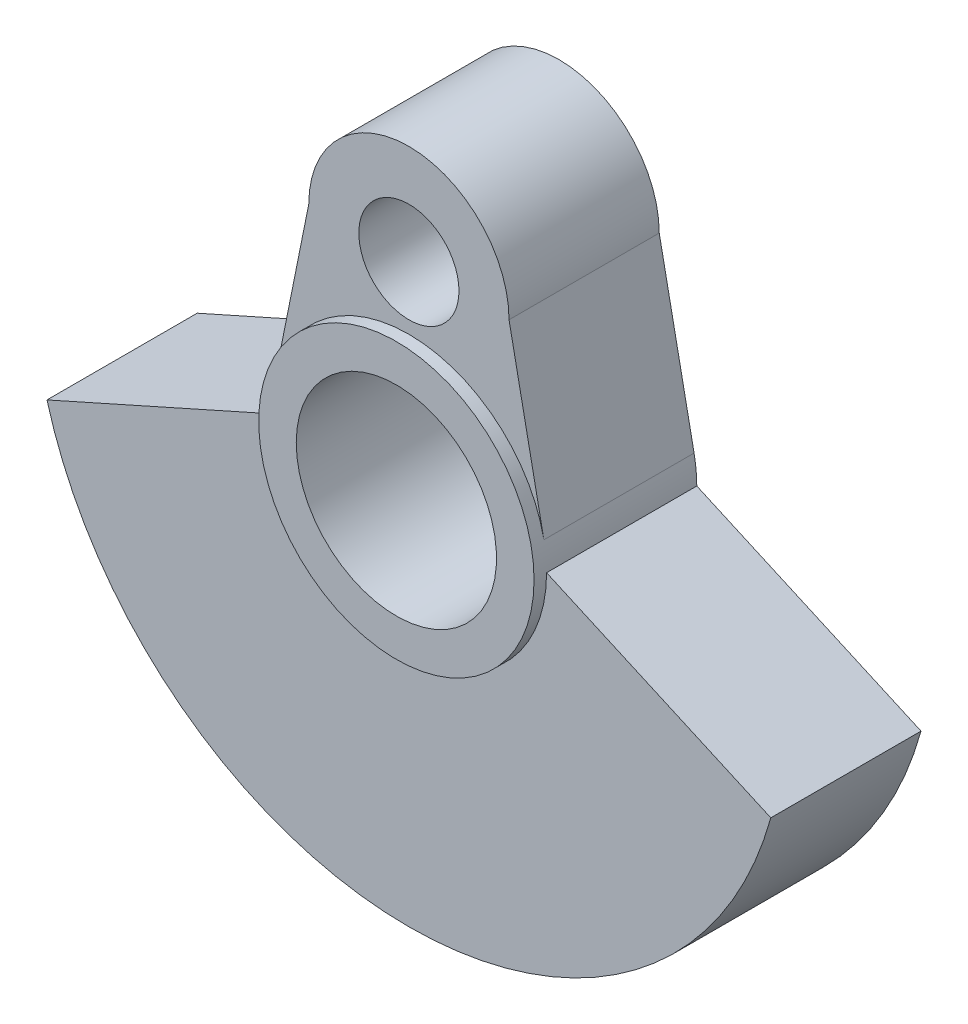
ISO-10303-21;
HEADER;
FILE_DESCRIPTION(('STEP AP214'),'2;1');
FILE_NAME('part.step','',(''),(''),'','','');
FILE_SCHEMA(('AUTOMOTIVE_DESIGN { 1 0 10303 214 1 1 1 1 }'));
ENDSEC;
DATA;
#1=APPLICATION_CONTEXT('core data for automotive mechanical design processes');
#2=APPLICATION_PROTOCOL_DEFINITION('international standard','automotive_design',2000,#1);
#3=PRODUCT_CONTEXT('',#1,'mechanical');
#4=PRODUCT('Part','Part','',(#3));
#5=PRODUCT_RELATED_PRODUCT_CATEGORY('part','',(#4));
#6=PRODUCT_DEFINITION_FORMATION('','',#4);
#7=PRODUCT_DEFINITION_CONTEXT('part definition',#1,'design');
#8=PRODUCT_DEFINITION('design','',#6,#7);
#9=PRODUCT_DEFINITION_SHAPE('','',#8);
#10=(LENGTH_UNIT() NAMED_UNIT(*) SI_UNIT(.MILLI.,.METRE.));
#11=(NAMED_UNIT(*) PLANE_ANGLE_UNIT() SI_UNIT($,.RADIAN.));
#12=(NAMED_UNIT(*) SI_UNIT($,.STERADIAN.) SOLID_ANGLE_UNIT());
#13=UNCERTAINTY_MEASURE_WITH_UNIT(LENGTH_MEASURE(1.E-05),#10,'distance_accuracy_value','');
#14=(GEOMETRIC_REPRESENTATION_CONTEXT(3) GLOBAL_UNCERTAINTY_ASSIGNED_CONTEXT((#13)) GLOBAL_UNIT_ASSIGNED_CONTEXT((#10,
#11,#12)) REPRESENTATION_CONTEXT('',''));
#15=CARTESIAN_POINT('',(0.,0.,0.));
#16=DIRECTION('',(0.,0.,1.));
#17=DIRECTION('',(1.,0.,0.));
#18=AXIS2_PLACEMENT_3D('',#15,#16,#17);
#19=CARTESIAN_POINT('',(0.,0.,3.5));
#20=DIRECTION('',(0.,0.,-1.));
#21=DIRECTION('',(-1.,0.,0.));
#22=AXIS2_PLACEMENT_3D('',#19,#20,#21);
#23=CYLINDRICAL_SURFACE('',#22,5.5);
#24=CARTESIAN_POINT('',(0.,0.,3.5));
#25=DIRECTION('',(0.,0.,1.));
#26=DIRECTION('',(1.,0.,0.));
#27=AXIS2_PLACEMENT_3D('',#24,#25,#26);
#28=CIRCLE('',#27,5.5);
#29=CARTESIAN_POINT('',(5.5,0.,3.5));
#30=VERTEX_POINT('',#29);
#31=EDGE_CURVE('E155',#30,#30,#28,.T.);
#32=ORIENTED_EDGE('',*,*,#31,.F.);
#33=EDGE_LOOP('',(#32));
#34=FACE_BOUND('',#33,.T.);
#35=DIRECTION('',(0.,0.,-1.));
#36=VECTOR('',#35,1.);
#37=CARTESIAN_POINT('',(-5.5,0.,3.));
#38=LINE('',#37,#36);
#39=CARTESIAN_POINT('',(-5.5,0.,3.));
#40=VERTEX_POINT('',#39);
#41=CARTESIAN_POINT('',(-5.5,0.,-3.));
#42=VERTEX_POINT('',#41);
#43=EDGE_CURVE('E72',#40,#42,#38,.T.);
#44=ORIENTED_EDGE('',*,*,#43,.F.);
#45=CARTESIAN_POINT('',(0.,0.,3.));
#46=DIRECTION('',(0.,0.,1.));
#47=DIRECTION('',(1.,0.,0.));
#48=AXIS2_PLACEMENT_3D('',#45,#46,#47);
#49=CIRCLE('',#48,5.5);
#50=CARTESIAN_POINT('',(5.5,0.,3.));
#51=VERTEX_POINT('',#50);
#52=EDGE_CURVE('E67',#40,#51,#49,.T.);
#53=ORIENTED_EDGE('',*,*,#52,.T.);
#54=DIRECTION('',(0.,0.,-1.));
#55=VECTOR('',#54,1.);
#56=CARTESIAN_POINT('',(5.5,0.,3.));
#57=LINE('',#56,#55);
#58=CARTESIAN_POINT('',(5.5,0.,-3.));
#59=VERTEX_POINT('',#58);
#60=EDGE_CURVE('E147',#51,#59,#57,.T.);
#61=ORIENTED_EDGE('',*,*,#60,.T.);
#62=CARTESIAN_POINT('',(0.,0.,-3.));
#63=DIRECTION('',(0.,0.,1.));
#64=DIRECTION('',(1.,0.,0.));
#65=AXIS2_PLACEMENT_3D('',#62,#63,#64);
#66=CIRCLE('',#65,5.5);
#67=CARTESIAN_POINT('',(5.39185239440812,1.08532380279594,-3.));
#68=VERTEX_POINT('',#67);
#69=EDGE_CURVE('E153',#59,#68,#66,.T.);
#70=ORIENTED_EDGE('',*,*,#69,.T.);
#71=DIRECTION('',(0.,0.,-1.));
#72=VECTOR('',#71,1.);
#73=CARTESIAN_POINT('',(5.39185239440812,1.08532380279594,3.));
#74=LINE('',#73,#72);
#75=CARTESIAN_POINT('',(5.39185239440812,1.08532380279594,3.));
#76=VERTEX_POINT('',#75);
#77=EDGE_CURVE('E183',#76,#68,#74,.T.);
#78=ORIENTED_EDGE('',*,*,#77,.F.);
#79=CARTESIAN_POINT('',(0.,0.,3.));
#80=DIRECTION('',(0.,0.,1.));
#81=DIRECTION('',(1.,0.,0.));
#82=AXIS2_PLACEMENT_3D('',#79,#80,#81);
#83=CIRCLE('',#82,5.5);
#84=CARTESIAN_POINT('',(-5.39185239440812,1.08532380279594,3.));
#85=VERTEX_POINT('',#84);
#86=EDGE_CURVE('E180',#76,#85,#83,.T.);
#87=ORIENTED_EDGE('',*,*,#86,.T.);
#88=DIRECTION('',(0.,0.,-1.));
#89=VECTOR('',#88,1.);
#90=CARTESIAN_POINT('',(-5.39185239440812,1.08532380279594,3.));
#91=LINE('',#90,#89);
#92=CARTESIAN_POINT('',(-5.39185239440812,1.08532380279594,-3.));
#93=VERTEX_POINT('',#92);
#94=EDGE_CURVE('E201',#85,#93,#91,.T.);
#95=ORIENTED_EDGE('',*,*,#94,.T.);
#96=EDGE_CURVE('E160',#93,#42,#66,.T.);
#97=ORIENTED_EDGE('',*,*,#96,.T.);
#98=EDGE_LOOP('',(#44,#53,#61,#70,#78,#87,#95,#97));
#99=FACE_BOUND('',#98,.T.);
#100=ADVANCED_FACE('F51',(#34,#99),#23,.T.);
#101=CARTESIAN_POINT('',(5.39185239440812,1.08532380279594,3.));
#102=DIRECTION('',(0.980336798983294,0.197331600508353,0.));
#103=DIRECTION('',(-0.197331600508353,0.980336798983294,0.));
#104=AXIS2_PLACEMENT_3D('',#101,#102,#103);
#105=PLANE('',#104);
#106=DIRECTION('',(0.197331600508353,-0.980336798983294,0.));
#107=VECTOR('',#106,1.);
#108=CARTESIAN_POINT('',(5.39185239440812,1.08532380279594,-3.));
#109=LINE('',#108,#107);
#110=CARTESIAN_POINT('',(4.,8.,-3.));
#111=VERTEX_POINT('',#110);
#112=EDGE_CURVE('E187',#111,#68,#109,.T.);
#113=ORIENTED_EDGE('',*,*,#112,.F.);
#114=DIRECTION('',(0.,0.,-1.));
#115=VECTOR('',#114,1.);
#116=CARTESIAN_POINT('',(4.,8.,3.));
#117=LINE('',#116,#115);
#118=CARTESIAN_POINT('',(4.,8.,3.));
#119=VERTEX_POINT('',#118);
#120=EDGE_CURVE('E12',#119,#111,#117,.T.);
#121=ORIENTED_EDGE('',*,*,#120,.F.);
#122=DIRECTION('',(0.197331600508353,-0.980336798983294,0.));
#123=VECTOR('',#122,1.);
#124=CARTESIAN_POINT('',(5.39185239440812,1.08532380279594,3.));
#125=LINE('',#124,#123);
#126=EDGE_CURVE('E167',#119,#76,#125,.T.);
#127=ORIENTED_EDGE('',*,*,#126,.T.);
#128=ORIENTED_EDGE('',*,*,#77,.T.);
#129=EDGE_LOOP('',(#113,#121,#127,#128));
#130=FACE_BOUND('',#129,.T.);
#131=ADVANCED_FACE('F219',(#130),#105,.T.);
#132=CARTESIAN_POINT('',(0.,8.,3.));
#133=DIRECTION('',(0.,0.,-1.));
#134=DIRECTION('',(-1.,0.,0.));
#135=AXIS2_PLACEMENT_3D('',#132,#133,#134);
#136=CYLINDRICAL_SURFACE('',#135,4.);
#137=CARTESIAN_POINT('',(0.,8.,-3.));
#138=DIRECTION('',(0.,0.,1.));
#139=DIRECTION('',(1.,0.,0.));
#140=AXIS2_PLACEMENT_3D('',#137,#138,#139);
#141=CIRCLE('',#140,4.);
#142=CARTESIAN_POINT('',(-4.,8.,-3.));
#143=VERTEX_POINT('',#142);
#144=EDGE_CURVE('E191',#111,#143,#141,.T.);
#145=ORIENTED_EDGE('',*,*,#144,.T.);
#146=DIRECTION('',(0.,0.,-1.));
#147=VECTOR('',#146,1.);
#148=CARTESIAN_POINT('',(-4.,8.,3.));
#149=LINE('',#148,#147);
#150=CARTESIAN_POINT('',(-4.,8.,3.));
#151=VERTEX_POINT('',#150);
#152=EDGE_CURVE('E60',#151,#143,#149,.T.);
#153=ORIENTED_EDGE('',*,*,#152,.F.);
#154=CARTESIAN_POINT('',(0.,8.,3.));
#155=DIRECTION('',(0.,0.,1.));
#156=DIRECTION('',(1.,0.,0.));
#157=AXIS2_PLACEMENT_3D('',#154,#155,#156);
#158=CIRCLE('',#157,4.);
#159=EDGE_CURVE('E172',#119,#151,#158,.T.);
#160=ORIENTED_EDGE('',*,*,#159,.F.);
#161=ORIENTED_EDGE('',*,*,#120,.T.);
#162=EDGE_LOOP('',(#145,#153,#160,#161));
#163=FACE_BOUND('',#162,.T.);
#164=ADVANCED_FACE('F213',(#163),#136,.T.);
#165=CARTESIAN_POINT('',(-5.39185239440812,1.08532380279594,3.));
#166=DIRECTION('',(0.980336798983294,-0.197331600508353,0.));
#167=DIRECTION('',(0.197331600508353,0.980336798983294,0.));
#168=AXIS2_PLACEMENT_3D('',#165,#166,#167);
#169=PLANE('',#168);
#170=DIRECTION('',(-0.197331600508353,-0.980336798983294,0.));
#171=VECTOR('',#170,1.);
#172=CARTESIAN_POINT('',(-5.39185239440812,1.08532380279594,-3.));
#173=LINE('',#172,#171);
#174=EDGE_CURVE('E168',#143,#93,#173,.T.);
#175=ORIENTED_EDGE('',*,*,#174,.T.);
#176=ORIENTED_EDGE('',*,*,#94,.F.);
#177=DIRECTION('',(-0.197331600508353,-0.980336798983294,0.));
#178=VECTOR('',#177,1.);
#179=CARTESIAN_POINT('',(-5.39185239440812,1.08532380279594,3.));
#180=LINE('',#179,#178);
#181=EDGE_CURVE('E176',#151,#85,#180,.T.);
#182=ORIENTED_EDGE('',*,*,#181,.F.);
#183=ORIENTED_EDGE('',*,*,#152,.T.);
#184=EDGE_LOOP('',(#175,#176,#182,#183));
#185=FACE_BOUND('',#184,.T.);
#186=ADVANCED_FACE('F208',(#185),#169,.F.);
#187=CARTESIAN_POINT('',(0.,8.,3.));
#188=DIRECTION('',(0.,0.,-1.));
#189=DIRECTION('',(-1.,0.,0.));
#190=AXIS2_PLACEMENT_3D('',#187,#188,#189);
#191=CYLINDRICAL_SURFACE('',#190,2.);
#192=CARTESIAN_POINT('',(0.,8.,3.));
#193=DIRECTION('',(0.,0.,1.));
#194=DIRECTION('',(1.,0.,0.));
#195=AXIS2_PLACEMENT_3D('',#192,#193,#194);
#196=CIRCLE('',#195,2.);
#197=CARTESIAN_POINT('',(2.,8.,3.));
#198=VERTEX_POINT('',#197);
#199=EDGE_CURVE('E163',#198,#198,#196,.T.);
#200=ORIENTED_EDGE('',*,*,#199,.T.);
#201=EDGE_LOOP('',(#200));
#202=FACE_BOUND('',#201,.T.);
#203=CARTESIAN_POINT('',(0.,8.,-3.));
#204=DIRECTION('',(0.,0.,1.));
#205=DIRECTION('',(1.,0.,0.));
#206=AXIS2_PLACEMENT_3D('',#203,#204,#205);
#207=CIRCLE('',#206,2.);
#208=CARTESIAN_POINT('',(2.,8.,-3.));
#209=VERTEX_POINT('',#208);
#210=EDGE_CURVE('E159',#209,#209,#207,.T.);
#211=ORIENTED_EDGE('',*,*,#210,.F.);
#212=EDGE_LOOP('',(#211));
#213=FACE_BOUND('',#212,.T.);
#214=ADVANCED_FACE('F53',(#202,#213),#191,.F.);
#215=CARTESIAN_POINT('',(0.,0.,3.));
#216=DIRECTION('',(0.,0.,1.));
#217=DIRECTION('',(1.,0.,0.));
#218=AXIS2_PLACEMENT_3D('',#215,#216,#217);
#219=PLANE('',#218);
#220=ORIENTED_EDGE('',*,*,#199,.F.);
#221=EDGE_LOOP('',(#220));
#222=FACE_BOUND('',#221,.T.);
#223=ORIENTED_EDGE('',*,*,#126,.F.);
#224=ORIENTED_EDGE('',*,*,#159,.T.);
#225=ORIENTED_EDGE('',*,*,#181,.T.);
#226=ORIENTED_EDGE('',*,*,#86,.F.);
#227=EDGE_LOOP('',(#223,#224,#225,#226));
#228=FACE_BOUND('',#227,.T.);
#229=ADVANCED_FACE('F260',(#222,#228),#219,.T.);
#230=CARTESIAN_POINT('',(0.,0.,-3.));
#231=DIRECTION('',(0.,0.,1.));
#232=DIRECTION('',(1.,0.,0.));
#233=AXIS2_PLACEMENT_3D('',#230,#231,#232);
#234=PLANE('',#233);
#235=ORIENTED_EDGE('',*,*,#210,.T.);
#236=EDGE_LOOP('',(#235));
#237=FACE_BOUND('',#236,.T.);
#238=ORIENTED_EDGE('',*,*,#112,.T.);
#239=ORIENTED_EDGE('',*,*,#69,.F.);
#240=DIRECTION('',(0.9130842111692,-0.407771042759929,0.));
#241=VECTOR('',#240,1.);
#242=CARTESIAN_POINT('',(0.914524728224361,2.04781115503851,-3.));
#243=LINE('',#242,#241);
#244=CARTESIAN_POINT('',(14.456832294801,-4.,-3.));
#245=VERTEX_POINT('',#244);
#246=EDGE_CURVE('E134',#59,#245,#243,.T.);
#247=ORIENTED_EDGE('',*,*,#246,.T.);
#248=CARTESIAN_POINT('',(0.,0.,-3.));
#249=DIRECTION('',(0.,0.,1.));
#250=DIRECTION('',(1.,0.,0.));
#251=AXIS2_PLACEMENT_3D('',#248,#249,#250);
#252=CIRCLE('',#251,15.);
#253=CARTESIAN_POINT('',(-14.456832294801,-4.,-3.));
#254=VERTEX_POINT('',#253);
#255=EDGE_CURVE('E225',#254,#245,#252,.T.);
#256=ORIENTED_EDGE('',*,*,#255,.F.);
#257=DIRECTION('',(-0.9130842111692,-0.407771042759929,0.));
#258=VECTOR('',#257,1.);
#259=CARTESIAN_POINT('',(-0.914524728224361,2.04781115503851,-3.));
#260=LINE('',#259,#258);
#261=EDGE_CURVE('E138',#42,#254,#260,.T.);
#262=ORIENTED_EDGE('',*,*,#261,.F.);
#263=ORIENTED_EDGE('',*,*,#96,.F.);
#264=ORIENTED_EDGE('',*,*,#174,.F.);
#265=ORIENTED_EDGE('',*,*,#144,.F.);
#266=EDGE_LOOP('',(#238,#239,#247,#256,#262,#263,#264,#265));
#267=FACE_BOUND('',#266,.T.);
#268=CARTESIAN_POINT('',(0.,0.,-3.));
#269=DIRECTION('',(0.,0.,1.));
#270=DIRECTION('',(1.,0.,0.));
#271=AXIS2_PLACEMENT_3D('',#268,#269,#270);
#272=CIRCLE('',#271,4.);
#273=CARTESIAN_POINT('',(-4.,0.,-3.));
#274=VERTEX_POINT('',#273);
#275=EDGE_CURVE('E140',#274,#274,#272,.T.);
#276=ORIENTED_EDGE('',*,*,#275,.T.);
#277=EDGE_LOOP('',(#276));
#278=FACE_BOUND('',#277,.T.);
#279=ADVANCED_FACE('F216',(#237,#267,#278),#234,.F.);
#280=CARTESIAN_POINT('',(0.,0.,3.5));
#281=DIRECTION('',(0.,0.,1.));
#282=DIRECTION('',(1.,0.,0.));
#283=AXIS2_PLACEMENT_3D('',#280,#281,#282);
#284=PLANE('',#283);
#285=ORIENTED_EDGE('',*,*,#31,.T.);
#286=EDGE_LOOP('',(#285));
#287=FACE_BOUND('',#286,.T.);
#288=CARTESIAN_POINT('',(0.,0.,3.5));
#289=DIRECTION('',(0.,0.,1.));
#290=DIRECTION('',(1.,0.,0.));
#291=AXIS2_PLACEMENT_3D('',#288,#289,#290);
#292=CIRCLE('',#291,4.);
#293=CARTESIAN_POINT('',(-4.,0.,3.5));
#294=VERTEX_POINT('',#293);
#295=EDGE_CURVE('E145',#294,#294,#292,.T.);
#296=ORIENTED_EDGE('',*,*,#295,.F.);
#297=EDGE_LOOP('',(#296));
#298=FACE_BOUND('',#297,.T.);
#299=ADVANCED_FACE('F258',(#287,#298),#284,.T.);
#300=CARTESIAN_POINT('',(0.,0.,3.5));
#301=DIRECTION('',(0.,0.,-1.));
#302=DIRECTION('',(-1.,0.,0.));
#303=AXIS2_PLACEMENT_3D('',#300,#301,#302);
#304=CYLINDRICAL_SURFACE('',#303,4.);
#305=CARTESIAN_POINT('',(-4.,0.,3.5));
#306=CARTESIAN_POINT('',(-4.,0.,3.43229166666667));
#307=CARTESIAN_POINT('',(-4.,0.,3.36458333333333));
#308=CARTESIAN_POINT('',(-4.,0.,3.22916666666667));
#309=CARTESIAN_POINT('',(-4.,0.,3.16145833333333));
#310=CARTESIAN_POINT('',(-4.,0.,3.02604166666667));
#311=CARTESIAN_POINT('',(-4.,0.,2.95833333333333));
#312=CARTESIAN_POINT('',(-4.,0.,2.82291666666667));
#313=CARTESIAN_POINT('',(-4.,0.,2.75520833333333));
#314=CARTESIAN_POINT('',(-4.,0.,2.61979166666667));
#315=CARTESIAN_POINT('',(-4.,0.,2.55208333333333));
#316=CARTESIAN_POINT('',(-4.,0.,2.41666666666667));
#317=CARTESIAN_POINT('',(-4.,0.,2.34895833333333));
#318=CARTESIAN_POINT('',(-4.,0.,2.21354166666667));
#319=CARTESIAN_POINT('',(-4.,0.,2.14583333333333));
#320=CARTESIAN_POINT('',(-4.,0.,2.01041666666667));
#321=CARTESIAN_POINT('',(-4.,0.,1.94270833333333));
#322=CARTESIAN_POINT('',(-4.,0.,1.80729166666667));
#323=CARTESIAN_POINT('',(-4.,0.,1.73958333333333));
#324=CARTESIAN_POINT('',(-4.,0.,1.60416666666667));
#325=CARTESIAN_POINT('',(-4.,0.,1.53645833333333));
#326=CARTESIAN_POINT('',(-4.,0.,1.40104166666667));
#327=CARTESIAN_POINT('',(-4.,0.,1.33333333333333));
#328=CARTESIAN_POINT('',(-4.,0.,1.19791666666667));
#329=CARTESIAN_POINT('',(-4.,0.,1.13020833333333));
#330=CARTESIAN_POINT('',(-4.,0.,0.994791666666666));
#331=CARTESIAN_POINT('',(-4.,0.,0.927083333333333));
#332=CARTESIAN_POINT('',(-4.,0.,0.791666666666666));
#333=CARTESIAN_POINT('',(-4.,0.,0.723958333333333));
#334=CARTESIAN_POINT('',(-4.,0.,0.588541666666666));
#335=CARTESIAN_POINT('',(-4.,0.,0.520833333333333));
#336=CARTESIAN_POINT('',(-4.,0.,0.385416666666666));
#337=CARTESIAN_POINT('',(-4.,0.,0.317708333333333));
#338=CARTESIAN_POINT('',(-4.,0.,0.182291666666666));
#339=CARTESIAN_POINT('',(-4.,0.,0.114583333333333));
#340=CARTESIAN_POINT('',(-4.,0.,-0.0208333333333341));
#341=CARTESIAN_POINT('',(-4.,0.,-0.0885416666666673));
#342=CARTESIAN_POINT('',(-4.,0.,-0.223958333333334));
#343=CARTESIAN_POINT('',(-4.,0.,-0.291666666666667));
#344=CARTESIAN_POINT('',(-4.,0.,-0.427083333333334));
#345=CARTESIAN_POINT('',(-4.,0.,-0.494791666666667));
#346=CARTESIAN_POINT('',(-4.,0.,-0.630208333333333));
#347=CARTESIAN_POINT('',(-4.,0.,-0.697916666666666));
#348=CARTESIAN_POINT('',(-4.,0.,-0.833333333333333));
#349=CARTESIAN_POINT('',(-4.,0.,-0.901041666666667));
#350=CARTESIAN_POINT('',(-4.,0.,-1.03645833333333));
#351=CARTESIAN_POINT('',(-4.,0.,-1.10416666666667));
#352=CARTESIAN_POINT('',(-4.,0.,-1.23958333333333));
#353=CARTESIAN_POINT('',(-4.,0.,-1.30729166666667));
#354=CARTESIAN_POINT('',(-4.,0.,-1.44270833333333));
#355=CARTESIAN_POINT('',(-4.,0.,-1.51041666666667));
#356=CARTESIAN_POINT('',(-4.,0.,-1.64583333333333));
#357=CARTESIAN_POINT('',(-4.,0.,-1.71354166666667));
#358=CARTESIAN_POINT('',(-4.,0.,-1.84895833333333));
#359=CARTESIAN_POINT('',(-4.,0.,-1.91666666666667));
#360=CARTESIAN_POINT('',(-4.,0.,-2.05208333333333));
#361=CARTESIAN_POINT('',(-4.,0.,-2.11979166666667));
#362=CARTESIAN_POINT('',(-4.,0.,-2.25520833333333));
#363=CARTESIAN_POINT('',(-4.,0.,-2.32291666666667));
#364=CARTESIAN_POINT('',(-4.,0.,-2.45833333333333));
#365=CARTESIAN_POINT('',(-4.,0.,-2.52604166666667));
#366=CARTESIAN_POINT('',(-4.,0.,-2.66145833333333));
#367=CARTESIAN_POINT('',(-4.,0.,-2.72916666666667));
#368=CARTESIAN_POINT('',(-4.,0.,-2.86458333333333));
#369=CARTESIAN_POINT('',(-4.,0.,-2.93229166666667));
#370=CARTESIAN_POINT('',(-4.,0.,-3.));
#371=B_SPLINE_CURVE_WITH_KNOTS('',3,(#305,#306,#307,#308,#309,#310,#311,#312,#313,#314,#315,
#316,#317,#318,#319,#320,#321,#322,#323,#324,#325,#326,#327,#328,#329,#330,#331,#332,#333,#334,
#335,#336,#337,#338,#339,#340,#341,#342,#343,#344,#345,#346,#347,#348,#349,#350,#351,#352,#353,
#354,#355,#356,#357,#358,#359,#360,#361,#362,#363,#364,#365,#366,#367,#368,#369,#370),
.UNSPECIFIED.,.F.,.F.,(4,2,2,2,2,2,2,2,2,2,2,2,2,2,2,2,2,2,2,2,2,2,2,2,2,2,2,2,2,2,2,2,4),(0.,
0.203125,0.40625,0.609375,0.8125,1.015625,1.21875,1.421875,1.625,1.828125,2.03125,2.234375,
2.4375,2.640625,2.84375,3.046875,3.25,3.453125,3.65625,3.859375,4.0625,4.265625,4.46875,
4.671875,4.875,5.078125,5.28125,5.484375,5.6875,5.890625,6.09375,6.296875,6.5),.UNSPECIFIED.);
#372=EDGE_CURVE('BSEAM299',#294,#274,#371,.T.);
#373=ORIENTED_EDGE('',*,*,#295,.T.);
#374=ORIENTED_EDGE('',*,*,#275,.F.);
#375=ORIENTED_EDGE('',*,*,#372,.T.);
#376=ORIENTED_EDGE('',*,*,#372,.F.);
#377=EDGE_LOOP('',(#373,#375,#374,#376));
#378=FACE_BOUND('',#377,.T.);
#379=ADVANCED_FACE('F299',(#378),#304,.F.);
#380=CARTESIAN_POINT('',(-0.914524728224361,2.04781115503851,3.));
#381=DIRECTION('',(0.407771042759929,-0.9130842111692,0.));
#382=DIRECTION('',(0.9130842111692,0.407771042759929,0.));
#383=AXIS2_PLACEMENT_3D('',#380,#381,#382);
#384=PLANE('',#383);
#385=ORIENTED_EDGE('',*,*,#261,.T.);
#386=DIRECTION('',(0.,0.,-1.));
#387=VECTOR('',#386,1.);
#388=CARTESIAN_POINT('',(-14.456832294801,-4.,3.));
#389=LINE('',#388,#387);
#390=CARTESIAN_POINT('',(-14.456832294801,-4.,3.));
#391=VERTEX_POINT('',#390);
#392=EDGE_CURVE('E121',#391,#254,#389,.T.);
#393=ORIENTED_EDGE('',*,*,#392,.F.);
#394=DIRECTION('',(-0.9130842111692,-0.407771042759929,0.));
#395=VECTOR('',#394,1.);
#396=CARTESIAN_POINT('',(-0.914524728224361,2.04781115503851,3.));
#397=LINE('',#396,#395);
#398=EDGE_CURVE('E129',#40,#391,#397,.T.);
#399=ORIENTED_EDGE('',*,*,#398,.F.);
#400=ORIENTED_EDGE('',*,*,#43,.T.);
#401=EDGE_LOOP('',(#385,#393,#399,#400));
#402=FACE_BOUND('',#401,.T.);
#403=ADVANCED_FACE('F136',(#402),#384,.F.);
#404=CARTESIAN_POINT('',(0.,0.,3.));
#405=DIRECTION('',(0.,0.,-1.));
#406=DIRECTION('',(-1.,0.,0.));
#407=AXIS2_PLACEMENT_3D('',#404,#405,#406);
#408=CYLINDRICAL_SURFACE('',#407,15.);
#409=ORIENTED_EDGE('',*,*,#255,.T.);
#410=DIRECTION('',(0.,0.,-1.));
#411=VECTOR('',#410,1.);
#412=CARTESIAN_POINT('',(14.456832294801,-4.,3.));
#413=LINE('',#412,#411);
#414=CARTESIAN_POINT('',(14.456832294801,-4.,3.));
#415=VERTEX_POINT('',#414);
#416=EDGE_CURVE('E123',#415,#245,#413,.T.);
#417=ORIENTED_EDGE('',*,*,#416,.F.);
#418=CARTESIAN_POINT('',(0.,0.,3.));
#419=DIRECTION('',(0.,0.,1.));
#420=DIRECTION('',(1.,0.,0.));
#421=AXIS2_PLACEMENT_3D('',#418,#419,#420);
#422=CIRCLE('',#421,15.);
#423=EDGE_CURVE('E116',#391,#415,#422,.T.);
#424=ORIENTED_EDGE('',*,*,#423,.F.);
#425=ORIENTED_EDGE('',*,*,#392,.T.);
#426=EDGE_LOOP('',(#409,#417,#424,#425));
#427=FACE_BOUND('',#426,.T.);
#428=ADVANCED_FACE('F119',(#427),#408,.T.);
#429=CARTESIAN_POINT('',(0.914524728224361,2.04781115503851,3.));
#430=DIRECTION('',(0.407771042759929,0.9130842111692,0.));
#431=DIRECTION('',(-0.9130842111692,0.407771042759929,0.));
#432=AXIS2_PLACEMENT_3D('',#429,#430,#431);
#433=PLANE('',#432);
#434=ORIENTED_EDGE('',*,*,#246,.F.);
#435=ORIENTED_EDGE('',*,*,#60,.F.);
#436=DIRECTION('',(0.9130842111692,-0.407771042759929,0.));
#437=VECTOR('',#436,1.);
#438=CARTESIAN_POINT('',(0.914524728224361,2.04781115503851,3.));
#439=LINE('',#438,#437);
#440=EDGE_CURVE('E128',#51,#415,#439,.T.);
#441=ORIENTED_EDGE('',*,*,#440,.T.);
#442=ORIENTED_EDGE('',*,*,#416,.T.);
#443=EDGE_LOOP('',(#434,#435,#441,#442));
#444=FACE_BOUND('',#443,.T.);
#445=ADVANCED_FACE('F240',(#444),#433,.T.);
#446=CARTESIAN_POINT('',(0.,0.,3.));
#447=DIRECTION('',(0.,0.,1.));
#448=DIRECTION('',(1.,0.,0.));
#449=AXIS2_PLACEMENT_3D('',#446,#447,#448);
#450=PLANE('',#449);
#451=ORIENTED_EDGE('',*,*,#398,.T.);
#452=ORIENTED_EDGE('',*,*,#423,.T.);
#453=ORIENTED_EDGE('',*,*,#440,.F.);
#454=ORIENTED_EDGE('',*,*,#52,.F.);
#455=EDGE_LOOP('',(#451,#452,#453,#454));
#456=FACE_BOUND('',#455,.T.);
#457=ADVANCED_FACE('F131',(#456),#450,.T.);
#458=CLOSED_SHELL('',(#100,#131,#164,#186,#214,#229,#279,#299,#379,#403,#428,#445,#457));
#459=MANIFOLD_SOLID_BREP('B2',#458);
#460=ADVANCED_BREP_SHAPE_REPRESENTATION('',(#18,#459),#14);
#461=SHAPE_DEFINITION_REPRESENTATION(#9,#460);
ENDSEC;
END-ISO-10303-21;
